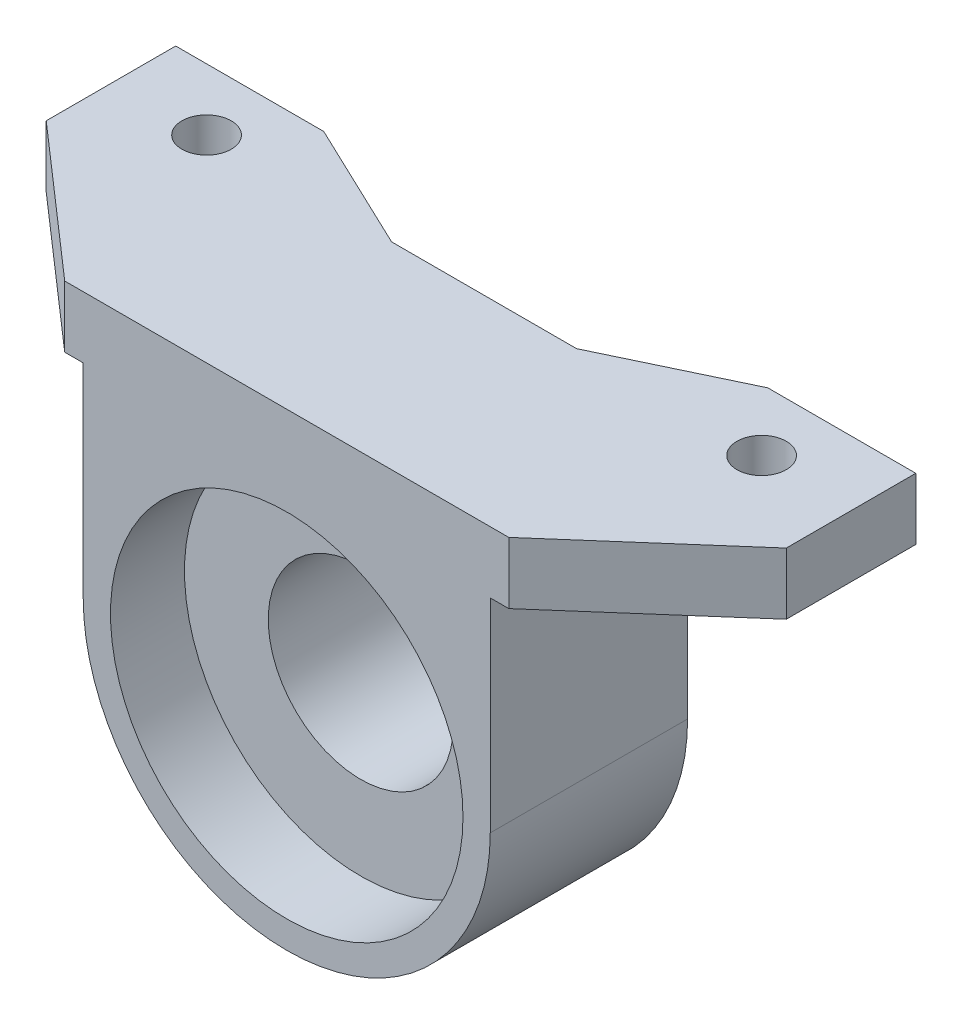
ISO-10303-21;
HEADER;
FILE_DESCRIPTION(('STEP AP214'),'2;1');
FILE_NAME('part.step','',(''),(''),'','','');
FILE_SCHEMA(('AUTOMOTIVE_DESIGN { 1 0 10303 214 1 1 1 1 }'));
ENDSEC;
DATA;
#1=APPLICATION_CONTEXT('core data for automotive mechanical design processes');
#2=APPLICATION_PROTOCOL_DEFINITION('international standard','automotive_design',2000,#1);
#3=PRODUCT_CONTEXT('',#1,'mechanical');
#4=PRODUCT('Part','Part','',(#3));
#5=PRODUCT_RELATED_PRODUCT_CATEGORY('part','',(#4));
#6=PRODUCT_DEFINITION_FORMATION('','',#4);
#7=PRODUCT_DEFINITION_CONTEXT('part definition',#1,'design');
#8=PRODUCT_DEFINITION('design','',#6,#7);
#9=PRODUCT_DEFINITION_SHAPE('','',#8);
#10=(LENGTH_UNIT() NAMED_UNIT(*) SI_UNIT(.MILLI.,.METRE.));
#11=(NAMED_UNIT(*) PLANE_ANGLE_UNIT() SI_UNIT($,.RADIAN.));
#12=(NAMED_UNIT(*) SI_UNIT($,.STERADIAN.) SOLID_ANGLE_UNIT());
#13=UNCERTAINTY_MEASURE_WITH_UNIT(LENGTH_MEASURE(1.E-05),#10,'distance_accuracy_value','');
#14=(GEOMETRIC_REPRESENTATION_CONTEXT(3) GLOBAL_UNCERTAINTY_ASSIGNED_CONTEXT((#13)) GLOBAL_UNIT_ASSIGNED_CONTEXT((#10,
#11,#12)) REPRESENTATION_CONTEXT('',''));
#15=CARTESIAN_POINT('',(0.,0.,0.));
#16=DIRECTION('',(0.,0.,1.));
#17=DIRECTION('',(1.,0.,0.));
#18=AXIS2_PLACEMENT_3D('',#15,#16,#17);
#19=CARTESIAN_POINT('',(0.,0.,6.));
#20=DIRECTION('',(0.,0.,1.));
#21=DIRECTION('',(1.,0.,0.));
#22=AXIS2_PLACEMENT_3D('',#19,#20,#21);
#23=PLANE('',#22);
#24=CARTESIAN_POINT('',(0.,0.,6.));
#25=DIRECTION('',(0.,0.,1.));
#26=DIRECTION('',(1.,0.,0.));
#27=AXIS2_PLACEMENT_3D('',#24,#25,#26);
#28=CIRCLE('',#27,14.29);
#29=CARTESIAN_POINT('',(14.29,0.,6.));
#30=VERTEX_POINT('',#29);
#31=EDGE_CURVE('E70',#30,#30,#28,.T.);
#32=ORIENTED_EDGE('',*,*,#31,.F.);
#33=EDGE_LOOP('',(#32));
#34=FACE_BOUND('',#33,.T.);
#35=DIRECTION('',(1.,0.,0.));
#36=VECTOR('',#35,1.);
#37=CARTESIAN_POINT('',(0.,16.5,6.));
#38=LINE('',#37,#36);
#39=CARTESIAN_POINT('',(16.5,16.5,6.));
#40=VERTEX_POINT('',#39);
#41=CARTESIAN_POINT('',(18.,16.5,6.));
#42=VERTEX_POINT('',#41);
#43=EDGE_CURVE('E232',#40,#42,#38,.T.);
#44=ORIENTED_EDGE('',*,*,#43,.T.);
#45=DIRECTION('',(0.,1.,0.));
#46=VECTOR('',#45,1.);
#47=CARTESIAN_POINT('',(18.,16.5,6.));
#48=LINE('',#47,#46);
#49=CARTESIAN_POINT('',(18.,21.5,6.));
#50=VERTEX_POINT('',#49);
#51=EDGE_CURVE('E315',#42,#50,#48,.T.);
#52=ORIENTED_EDGE('',*,*,#51,.T.);
#53=DIRECTION('',(1.,0.,0.));
#54=VECTOR('',#53,1.);
#55=CARTESIAN_POINT('',(-30.,21.5,6.));
#56=LINE('',#55,#54);
#57=CARTESIAN_POINT('',(-18.,21.5,6.00000000000001));
#58=VERTEX_POINT('',#57);
#59=EDGE_CURVE('E215',#58,#50,#56,.T.);
#60=ORIENTED_EDGE('',*,*,#59,.F.);
#61=DIRECTION('',(0.,1.,0.));
#62=VECTOR('',#61,1.);
#63=CARTESIAN_POINT('',(-18.,16.5,6.00000000000001));
#64=LINE('',#63,#62);
#65=CARTESIAN_POINT('',(-18.,16.5,6.00000000000001));
#66=VERTEX_POINT('',#65);
#67=EDGE_CURVE('E194',#66,#58,#64,.T.);
#68=ORIENTED_EDGE('',*,*,#67,.F.);
#69=CARTESIAN_POINT('',(-16.5,16.5,6.));
#70=VERTEX_POINT('',#69);
#71=EDGE_CURVE('E236',#66,#70,#38,.T.);
#72=ORIENTED_EDGE('',*,*,#71,.T.);
#73=DIRECTION('',(0.,-1.,0.));
#74=VECTOR('',#73,1.);
#75=CARTESIAN_POINT('',(-16.5,0.,6.));
#76=LINE('',#75,#74);
#77=CARTESIAN_POINT('',(-16.5,0.,6.));
#78=VERTEX_POINT('',#77);
#79=EDGE_CURVE('E266',#70,#78,#76,.T.);
#80=ORIENTED_EDGE('',*,*,#79,.T.);
#81=CARTESIAN_POINT('',(0.,0.,6.));
#82=DIRECTION('',(0.,0.,1.));
#83=DIRECTION('',(1.,0.,0.));
#84=AXIS2_PLACEMENT_3D('',#81,#82,#83);
#85=CIRCLE('',#84,16.5);
#86=CARTESIAN_POINT('',(16.5,0.,6.));
#87=VERTEX_POINT('',#86);
#88=EDGE_CURVE('E12',#78,#87,#85,.T.);
#89=ORIENTED_EDGE('',*,*,#88,.T.);
#90=DIRECTION('',(0.,-1.,0.));
#91=VECTOR('',#90,1.);
#92=CARTESIAN_POINT('',(16.5,0.,6.));
#93=LINE('',#92,#91);
#94=EDGE_CURVE('E252',#40,#87,#93,.T.);
#95=ORIENTED_EDGE('',*,*,#94,.F.);
#96=EDGE_LOOP('',(#44,#52,#60,#68,#72,#80,#89,#95));
#97=FACE_BOUND('',#96,.T.);
#98=ADVANCED_FACE('F61',(#34,#97),#23,.T.);
#99=CARTESIAN_POINT('',(0.,16.5,0.));
#100=DIRECTION('',(0.,1.,0.));
#101=DIRECTION('',(0.,0.,1.));
#102=AXIS2_PLACEMENT_3D('',#99,#100,#101);
#103=PLANE('',#102);
#104=CARTESIAN_POINT('',(22.5,16.5,-10.));
#105=DIRECTION('',(0.,1.,0.));
#106=DIRECTION('',(0.,0.,1.));
#107=AXIS2_PLACEMENT_3D('',#104,#105,#106);
#108=CIRCLE('',#107,2.);
#109=CARTESIAN_POINT('',(22.5,16.5,-7.99999999999999));
#110=VERTEX_POINT('',#109);
#111=EDGE_CURVE('E237',#110,#110,#108,.T.);
#112=ORIENTED_EDGE('',*,*,#111,.T.);
#113=EDGE_LOOP('',(#112));
#114=FACE_BOUND('',#113,.T.);
#115=DIRECTION('',(0.752576694706878,0.,-0.658504607868518));
#116=VECTOR('',#115,1.);
#117=CARTESIAN_POINT('',(10.7787610619469,16.5,12.3185840707965));
#118=LINE('',#117,#116);
#119=CARTESIAN_POINT('',(30.,16.5,-4.50000000000001));
#120=VERTEX_POINT('',#119);
#121=EDGE_CURVE('E85',#42,#120,#118,.T.);
#122=ORIENTED_EDGE('',*,*,#121,.F.);
#123=ORIENTED_EDGE('',*,*,#43,.F.);
#124=DIRECTION('',(0.,0.,-1.));
#125=VECTOR('',#124,1.);
#126=CARTESIAN_POINT('',(16.5,16.5,6.));
#127=LINE('',#126,#125);
#128=CARTESIAN_POINT('',(16.5,16.5,-10.));
#129=VERTEX_POINT('',#128);
#130=EDGE_CURVE('E256',#40,#129,#127,.T.);
#131=ORIENTED_EDGE('',*,*,#130,.T.);
#132=DIRECTION('',(-1.,0.,0.));
#133=VECTOR('',#132,1.);
#134=CARTESIAN_POINT('',(30.,16.5,-10.));
#135=LINE('',#134,#133);
#136=CARTESIAN_POINT('',(7.5,16.5,-10.));
#137=VERTEX_POINT('',#136);
#138=EDGE_CURVE('E193',#129,#137,#135,.T.);
#139=ORIENTED_EDGE('',*,*,#138,.T.);
#140=DIRECTION('',(0.90286051882393,0.,-0.429933580392348));
#141=VECTOR('',#140,1.);
#142=CARTESIAN_POINT('',(-2.49537892791127,16.5,-5.24029574861367));
#143=LINE('',#142,#141);
#144=CARTESIAN_POINT('',(18.,16.5,-15.));
#145=VERTEX_POINT('',#144);
#146=EDGE_CURVE('E185',#137,#145,#143,.T.);
#147=ORIENTED_EDGE('',*,*,#146,.T.);
#148=DIRECTION('',(-1.,0.,0.));
#149=VECTOR('',#148,1.);
#150=CARTESIAN_POINT('',(30.,16.5,-15.));
#151=LINE('',#150,#149);
#152=CARTESIAN_POINT('',(30.,16.5,-15.));
#153=VERTEX_POINT('',#152);
#154=EDGE_CURVE('E343',#153,#145,#151,.T.);
#155=ORIENTED_EDGE('',*,*,#154,.F.);
#156=DIRECTION('',(0.,0.,-1.));
#157=VECTOR('',#156,1.);
#158=CARTESIAN_POINT('',(30.,16.5,0.));
#159=LINE('',#158,#157);
#160=EDGE_CURVE('E241',#120,#153,#159,.T.);
#161=ORIENTED_EDGE('',*,*,#160,.F.);
#162=EDGE_LOOP('',(#122,#123,#131,#139,#147,#155,#161));
#163=FACE_BOUND('',#162,.T.);
#164=ADVANCED_FACE('F303',(#114,#163),#103,.F.);
#165=CARTESIAN_POINT('',(-22.5,16.5,-10.));
#166=DIRECTION('',(0.,1.,0.));
#167=DIRECTION('',(0.,0.,1.));
#168=AXIS2_PLACEMENT_3D('',#165,#166,#167);
#169=CIRCLE('',#168,2.);
#170=CARTESIAN_POINT('',(-22.5,16.5,-7.99999999999999));
#171=VERTEX_POINT('',#170);
#172=EDGE_CURVE('E247',#171,#171,#169,.T.);
#173=ORIENTED_EDGE('',*,*,#172,.T.);
#174=EDGE_LOOP('',(#173));
#175=FACE_BOUND('',#174,.T.);
#176=CARTESIAN_POINT('',(-18.,16.5,-15.));
#177=VERTEX_POINT('',#176);
#178=CARTESIAN_POINT('',(-30.,16.5,-15.));
#179=VERTEX_POINT('',#178);
#180=EDGE_CURVE('E183',#177,#179,#151,.T.);
#181=ORIENTED_EDGE('',*,*,#180,.F.);
#182=DIRECTION('',(0.90286051882393,0.,0.429933580392348));
#183=VECTOR('',#182,1.);
#184=CARTESIAN_POINT('',(2.49537892791128,16.5,-5.24029574861368));
#185=LINE('',#184,#183);
#186=CARTESIAN_POINT('',(-7.49999999999999,16.5,-9.99999999999999));
#187=VERTEX_POINT('',#186);
#188=EDGE_CURVE('E164',#177,#187,#185,.T.);
#189=ORIENTED_EDGE('',*,*,#188,.T.);
#190=CARTESIAN_POINT('',(-16.5,16.5,-10.));
#191=VERTEX_POINT('',#190);
#192=EDGE_CURVE('E180',#187,#191,#135,.T.);
#193=ORIENTED_EDGE('',*,*,#192,.T.);
#194=DIRECTION('',(0.,0.,-1.));
#195=VECTOR('',#194,1.);
#196=CARTESIAN_POINT('',(-16.5,16.5,6.));
#197=LINE('',#196,#195);
#198=EDGE_CURVE('E275',#70,#191,#197,.T.);
#199=ORIENTED_EDGE('',*,*,#198,.F.);
#200=ORIENTED_EDGE('',*,*,#71,.F.);
#201=DIRECTION('',(0.752576694706878,0.,0.658504607868518));
#202=VECTOR('',#201,1.);
#203=CARTESIAN_POINT('',(-10.7787610619469,16.5,12.3185840707965));
#204=LINE('',#203,#202);
#205=CARTESIAN_POINT('',(-30.,16.5,-4.50000000000001));
#206=VERTEX_POINT('',#205);
#207=EDGE_CURVE('E330',#206,#66,#204,.T.);
#208=ORIENTED_EDGE('',*,*,#207,.F.);
#209=DIRECTION('',(0.,0.,-1.));
#210=VECTOR('',#209,1.);
#211=CARTESIAN_POINT('',(-30.,16.5,0.));
#212=LINE('',#211,#210);
#213=EDGE_CURVE('E244',#206,#179,#212,.T.);
#214=ORIENTED_EDGE('',*,*,#213,.T.);
#215=EDGE_LOOP('',(#181,#189,#193,#199,#200,#208,#214));
#216=FACE_BOUND('',#215,.T.);
#217=ADVANCED_FACE('F178',(#175,#216),#103,.F.);
#218=CARTESIAN_POINT('',(0.,21.5,0.));
#219=DIRECTION('',(0.,1.,0.));
#220=DIRECTION('',(0.,0.,1.));
#221=AXIS2_PLACEMENT_3D('',#218,#219,#220);
#222=PLANE('',#221);
#223=CARTESIAN_POINT('',(22.5,21.5,-10.));
#224=DIRECTION('',(0.,1.,0.));
#225=DIRECTION('',(0.,0.,1.));
#226=AXIS2_PLACEMENT_3D('',#223,#224,#225);
#227=CIRCLE('',#226,2.);
#228=CARTESIAN_POINT('',(22.5,21.5,-7.99999999999999));
#229=VERTEX_POINT('',#228);
#230=EDGE_CURVE('E228',#229,#229,#227,.T.);
#231=ORIENTED_EDGE('',*,*,#230,.F.);
#232=EDGE_LOOP('',(#231));
#233=FACE_BOUND('',#232,.T.);
#234=CARTESIAN_POINT('',(-22.5,21.5,-10.));
#235=DIRECTION('',(0.,1.,0.));
#236=DIRECTION('',(0.,0.,1.));
#237=AXIS2_PLACEMENT_3D('',#234,#235,#236);
#238=CIRCLE('',#237,2.);
#239=CARTESIAN_POINT('',(-22.5,21.5,-7.99999999999999));
#240=VERTEX_POINT('',#239);
#241=EDGE_CURVE('E219',#240,#240,#238,.T.);
#242=ORIENTED_EDGE('',*,*,#241,.F.);
#243=EDGE_LOOP('',(#242));
#244=FACE_BOUND('',#243,.T.);
#245=ORIENTED_EDGE('',*,*,#59,.T.);
#246=DIRECTION('',(0.752576694706878,0.,-0.658504607868518));
#247=VECTOR('',#246,1.);
#248=CARTESIAN_POINT('',(10.7787610619469,21.5,12.3185840707965));
#249=LINE('',#248,#247);
#250=CARTESIAN_POINT('',(30.,21.5,-4.50000000000001));
#251=VERTEX_POINT('',#250);
#252=EDGE_CURVE('E364',#50,#251,#249,.T.);
#253=ORIENTED_EDGE('',*,*,#252,.T.);
#254=DIRECTION('',(0.,0.,-1.));
#255=VECTOR('',#254,1.);
#256=CARTESIAN_POINT('',(30.,21.5,0.));
#257=LINE('',#256,#255);
#258=CARTESIAN_POINT('',(30.,21.5,-15.));
#259=VERTEX_POINT('',#258);
#260=EDGE_CURVE('E220',#251,#259,#257,.T.);
#261=ORIENTED_EDGE('',*,*,#260,.T.);
#262=DIRECTION('',(1.,0.,0.));
#263=VECTOR('',#262,1.);
#264=CARTESIAN_POINT('',(30.,21.5,-15.));
#265=LINE('',#264,#263);
#266=CARTESIAN_POINT('',(18.,21.5,-15.));
#267=VERTEX_POINT('',#266);
#268=EDGE_CURVE('E337',#267,#259,#265,.T.);
#269=ORIENTED_EDGE('',*,*,#268,.F.);
#270=DIRECTION('',(0.90286051882393,0.,-0.429933580392348));
#271=VECTOR('',#270,1.);
#272=CARTESIAN_POINT('',(-2.49537892791127,21.5,-5.24029574861367));
#273=LINE('',#272,#271);
#274=CARTESIAN_POINT('',(7.5,21.5,-10.));
#275=VERTEX_POINT('',#274);
#276=EDGE_CURVE('E186',#275,#267,#273,.T.);
#277=ORIENTED_EDGE('',*,*,#276,.F.);
#278=DIRECTION('',(1.,0.,0.));
#279=VECTOR('',#278,1.);
#280=CARTESIAN_POINT('',(0.,21.5,-10.));
#281=LINE('',#280,#279);
#282=CARTESIAN_POINT('',(-7.49999999999999,21.5,-9.99999999999999));
#283=VERTEX_POINT('',#282);
#284=EDGE_CURVE('E380',#283,#275,#281,.T.);
#285=ORIENTED_EDGE('',*,*,#284,.F.);
#286=DIRECTION('',(0.90286051882393,0.,0.429933580392348));
#287=VECTOR('',#286,1.);
#288=CARTESIAN_POINT('',(2.49537892791128,21.5,-5.24029574861368));
#289=LINE('',#288,#287);
#290=CARTESIAN_POINT('',(-18.,21.5,-15.));
#291=VERTEX_POINT('',#290);
#292=EDGE_CURVE('E167',#291,#283,#289,.T.);
#293=ORIENTED_EDGE('',*,*,#292,.F.);
#294=CARTESIAN_POINT('',(-30.,21.5,-15.));
#295=VERTEX_POINT('',#294);
#296=EDGE_CURVE('E204',#295,#291,#265,.T.);
#297=ORIENTED_EDGE('',*,*,#296,.F.);
#298=DIRECTION('',(0.,0.,-1.));
#299=VECTOR('',#298,1.);
#300=CARTESIAN_POINT('',(-30.,21.5,0.));
#301=LINE('',#300,#299);
#302=CARTESIAN_POINT('',(-30.,21.5,-4.50000000000001));
#303=VERTEX_POINT('',#302);
#304=EDGE_CURVE('E210',#303,#295,#301,.T.);
#305=ORIENTED_EDGE('',*,*,#304,.F.);
#306=DIRECTION('',(0.752576694706878,0.,0.658504607868518));
#307=VECTOR('',#306,1.);
#308=CARTESIAN_POINT('',(-10.7787610619469,21.5,12.3185840707965));
#309=LINE('',#308,#307);
#310=EDGE_CURVE('E77',#303,#58,#309,.T.);
#311=ORIENTED_EDGE('',*,*,#310,.T.);
#312=EDGE_LOOP('',(#245,#253,#261,#269,#277,#285,#293,#297,#305,#311));
#313=FACE_BOUND('',#312,.T.);
#314=ADVANCED_FACE('F394',(#233,#244,#313),#222,.T.);
#315=CARTESIAN_POINT('',(-30.,-16.5,0.));
#316=DIRECTION('',(1.,0.,0.));
#317=DIRECTION('',(0.,0.,-1.));
#318=AXIS2_PLACEMENT_3D('',#315,#316,#317);
#319=PLANE('',#318);
#320=DIRECTION('',(0.,1.,0.));
#321=VECTOR('',#320,1.);
#322=CARTESIAN_POINT('',(-30.,16.5,-4.50000000000001));
#323=LINE('',#322,#321);
#324=EDGE_CURVE('E200',#206,#303,#323,.T.);
#325=ORIENTED_EDGE('',*,*,#324,.T.);
#326=ORIENTED_EDGE('',*,*,#304,.T.);
#327=DIRECTION('',(0.,1.,0.));
#328=VECTOR('',#327,1.);
#329=CARTESIAN_POINT('',(-30.,21.5,-15.));
#330=LINE('',#329,#328);
#331=EDGE_CURVE('E340',#179,#295,#330,.T.);
#332=ORIENTED_EDGE('',*,*,#331,.F.);
#333=ORIENTED_EDGE('',*,*,#213,.F.);
#334=EDGE_LOOP('',(#325,#326,#332,#333));
#335=FACE_BOUND('',#334,.T.);
#336=ADVANCED_FACE('F422',(#335),#319,.F.);
#337=CARTESIAN_POINT('',(30.,-16.5,0.));
#338=DIRECTION('',(1.,0.,0.));
#339=DIRECTION('',(0.,0.,-1.));
#340=AXIS2_PLACEMENT_3D('',#337,#338,#339);
#341=PLANE('',#340);
#342=ORIENTED_EDGE('',*,*,#260,.F.);
#343=DIRECTION('',(0.,1.,0.));
#344=VECTOR('',#343,1.);
#345=CARTESIAN_POINT('',(30.,16.5,-4.50000000000001));
#346=LINE('',#345,#344);
#347=EDGE_CURVE('E357',#120,#251,#346,.T.);
#348=ORIENTED_EDGE('',*,*,#347,.F.);
#349=ORIENTED_EDGE('',*,*,#160,.T.);
#350=DIRECTION('',(0.,-1.,0.));
#351=VECTOR('',#350,1.);
#352=CARTESIAN_POINT('',(30.,21.5,-15.));
#353=LINE('',#352,#351);
#354=EDGE_CURVE('E199',#259,#153,#353,.T.);
#355=ORIENTED_EDGE('',*,*,#354,.F.);
#356=EDGE_LOOP('',(#342,#348,#349,#355));
#357=FACE_BOUND('',#356,.T.);
#358=ADVANCED_FACE('F397',(#357),#341,.T.);
#359=CARTESIAN_POINT('',(0.,0.,-15.));
#360=DIRECTION('',(0.,0.,-1.));
#361=DIRECTION('',(-1.,0.,0.));
#362=AXIS2_PLACEMENT_3D('',#359,#360,#361);
#363=PLANE('',#362);
#364=DIRECTION('',(0.,1.,0.));
#365=VECTOR('',#364,1.);
#366=CARTESIAN_POINT('',(18.,16.5,-15.));
#367=LINE('',#366,#365);
#368=EDGE_CURVE('E368',#145,#267,#367,.T.);
#369=ORIENTED_EDGE('',*,*,#368,.T.);
#370=ORIENTED_EDGE('',*,*,#268,.T.);
#371=ORIENTED_EDGE('',*,*,#354,.T.);
#372=ORIENTED_EDGE('',*,*,#154,.T.);
#373=EDGE_LOOP('',(#369,#370,#371,#372));
#374=FACE_BOUND('',#373,.T.);
#375=ADVANCED_FACE('F390',(#374),#363,.T.);
#376=CARTESIAN_POINT('',(0.,0.,-10.));
#377=DIRECTION('',(0.,0.,-1.));
#378=DIRECTION('',(-1.,0.,0.));
#379=AXIS2_PLACEMENT_3D('',#376,#377,#378);
#380=PLANE('',#379);
#381=CARTESIAN_POINT('',(0.,0.,-10.));
#382=DIRECTION('',(0.,0.,1.));
#383=DIRECTION('',(1.,0.,0.));
#384=AXIS2_PLACEMENT_3D('',#381,#382,#383);
#385=CIRCLE('',#384,7.5);
#386=CARTESIAN_POINT('',(7.5,0.,-10.));
#387=VERTEX_POINT('',#386);
#388=EDGE_CURVE('E206',#387,#387,#385,.T.);
#389=ORIENTED_EDGE('',*,*,#388,.T.);
#390=EDGE_LOOP('',(#389));
#391=FACE_BOUND('',#390,.T.);
#392=DIRECTION('',(0.,-1.,0.));
#393=VECTOR('',#392,1.);
#394=CARTESIAN_POINT('',(-16.5,0.,-10.));
#395=LINE('',#394,#393);
#396=CARTESIAN_POINT('',(-16.5,0.,-10.));
#397=VERTEX_POINT('',#396);
#398=EDGE_CURVE('E191',#191,#397,#395,.T.);
#399=ORIENTED_EDGE('',*,*,#398,.F.);
#400=ORIENTED_EDGE('',*,*,#192,.F.);
#401=DIRECTION('',(0.,1.,0.));
#402=VECTOR('',#401,1.);
#403=CARTESIAN_POINT('',(-7.49999999999999,16.5,-9.99999999999999));
#404=LINE('',#403,#402);
#405=EDGE_CURVE('E161',#187,#283,#404,.T.);
#406=ORIENTED_EDGE('',*,*,#405,.T.);
#407=ORIENTED_EDGE('',*,*,#284,.T.);
#408=DIRECTION('',(0.,1.,0.));
#409=VECTOR('',#408,1.);
#410=CARTESIAN_POINT('',(7.5,16.5,-10.));
#411=LINE('',#410,#409);
#412=EDGE_CURVE('E173',#137,#275,#411,.T.);
#413=ORIENTED_EDGE('',*,*,#412,.F.);
#414=ORIENTED_EDGE('',*,*,#138,.F.);
#415=DIRECTION('',(0.,-1.,0.));
#416=VECTOR('',#415,1.);
#417=CARTESIAN_POINT('',(16.5,0.,-10.));
#418=LINE('',#417,#416);
#419=CARTESIAN_POINT('',(16.5,0.,-10.));
#420=VERTEX_POINT('',#419);
#421=EDGE_CURVE('E251',#129,#420,#418,.T.);
#422=ORIENTED_EDGE('',*,*,#421,.T.);
#423=CARTESIAN_POINT('',(0.,0.,-10.));
#424=DIRECTION('',(0.,0.,-1.));
#425=DIRECTION('',(-1.,0.,0.));
#426=AXIS2_PLACEMENT_3D('',#423,#424,#425);
#427=CIRCLE('',#426,16.5);
#428=EDGE_CURVE('E278',#420,#397,#427,.T.);
#429=ORIENTED_EDGE('',*,*,#428,.T.);
#430=EDGE_LOOP('',(#399,#400,#406,#407,#413,#414,#422,#429));
#431=FACE_BOUND('',#430,.T.);
#432=ADVANCED_FACE('F189',(#391,#431),#380,.T.);
#433=CARTESIAN_POINT('',(0.,0.,6.));
#434=DIRECTION('',(0.,0.,-1.));
#435=DIRECTION('',(-1.,0.,0.));
#436=AXIS2_PLACEMENT_3D('',#433,#434,#435);
#437=CYLINDRICAL_SURFACE('',#436,16.5);
#438=DIRECTION('',(0.,0.,-1.));
#439=VECTOR('',#438,1.);
#440=CARTESIAN_POINT('',(16.5,0.,6.));
#441=LINE('',#440,#439);
#442=EDGE_CURVE('E263',#87,#420,#441,.T.);
#443=ORIENTED_EDGE('',*,*,#442,.F.);
#444=ORIENTED_EDGE('',*,*,#88,.F.);
#445=DIRECTION('',(0.,0.,-1.));
#446=VECTOR('',#445,1.);
#447=CARTESIAN_POINT('',(-16.5,0.,6.));
#448=LINE('',#447,#446);
#449=EDGE_CURVE('E269',#78,#397,#448,.T.);
#450=ORIENTED_EDGE('',*,*,#449,.T.);
#451=ORIENTED_EDGE('',*,*,#428,.F.);
#452=EDGE_LOOP('',(#443,#444,#450,#451));
#453=FACE_BOUND('',#452,.T.);
#454=ADVANCED_FACE('F63',(#453),#437,.T.);
#455=CARTESIAN_POINT('',(0.,0.,6.));
#456=DIRECTION('',(0.,0.,-1.));
#457=DIRECTION('',(-1.,0.,0.));
#458=AXIS2_PLACEMENT_3D('',#455,#456,#457);
#459=CYLINDRICAL_SURFACE('',#458,14.29);
#460=ORIENTED_EDGE('',*,*,#31,.T.);
#461=EDGE_LOOP('',(#460));
#462=FACE_BOUND('',#461,.T.);
#463=CARTESIAN_POINT('',(0.,0.,0.));
#464=DIRECTION('',(0.,0.,1.));
#465=DIRECTION('',(1.,0.,0.));
#466=AXIS2_PLACEMENT_3D('',#463,#464,#465);
#467=CIRCLE('',#466,14.29);
#468=CARTESIAN_POINT('',(14.29,0.,0.));
#469=VERTEX_POINT('',#468);
#470=EDGE_CURVE('E281',#469,#469,#467,.T.);
#471=ORIENTED_EDGE('',*,*,#470,.F.);
#472=EDGE_LOOP('',(#471));
#473=FACE_BOUND('',#472,.T.);
#474=ADVANCED_FACE('F290',(#462,#473),#459,.F.);
#475=CARTESIAN_POINT('',(0.,0.,0.));
#476=DIRECTION('',(0.,0.,-1.));
#477=DIRECTION('',(-1.,0.,0.));
#478=AXIS2_PLACEMENT_3D('',#475,#476,#477);
#479=PLANE('',#478);
#480=CARTESIAN_POINT('',(0.,0.,0.));
#481=DIRECTION('',(0.,0.,1.));
#482=DIRECTION('',(1.,0.,0.));
#483=AXIS2_PLACEMENT_3D('',#480,#481,#482);
#484=CIRCLE('',#483,7.5);
#485=CARTESIAN_POINT('',(7.5,0.,0.));
#486=VERTEX_POINT('',#485);
#487=EDGE_CURVE('E211',#486,#486,#484,.T.);
#488=ORIENTED_EDGE('',*,*,#487,.F.);
#489=EDGE_LOOP('',(#488));
#490=FACE_BOUND('',#489,.T.);
#491=ORIENTED_EDGE('',*,*,#470,.T.);
#492=EDGE_LOOP('',(#491));
#493=FACE_BOUND('',#492,.T.);
#494=ADVANCED_FACE('F288',(#490,#493),#479,.F.);
#495=CARTESIAN_POINT('',(-16.5,0.,6.));
#496=DIRECTION('',(1.,0.,0.));
#497=DIRECTION('',(0.,1.,0.));
#498=AXIS2_PLACEMENT_3D('',#495,#496,#497);
#499=PLANE('',#498);
#500=ORIENTED_EDGE('',*,*,#398,.T.);
#501=ORIENTED_EDGE('',*,*,#449,.F.);
#502=ORIENTED_EDGE('',*,*,#79,.F.);
#503=ORIENTED_EDGE('',*,*,#198,.T.);
#504=EDGE_LOOP('',(#500,#501,#502,#503));
#505=FACE_BOUND('',#504,.T.);
#506=ADVANCED_FACE('F298',(#505),#499,.F.);
#507=CARTESIAN_POINT('',(16.5,0.,6.));
#508=DIRECTION('',(1.,0.,0.));
#509=DIRECTION('',(0.,1.,0.));
#510=AXIS2_PLACEMENT_3D('',#507,#508,#509);
#511=PLANE('',#510);
#512=ORIENTED_EDGE('',*,*,#421,.F.);
#513=ORIENTED_EDGE('',*,*,#130,.F.);
#514=ORIENTED_EDGE('',*,*,#94,.T.);
#515=ORIENTED_EDGE('',*,*,#442,.T.);
#516=EDGE_LOOP('',(#512,#513,#514,#515));
#517=FACE_BOUND('',#516,.T.);
#518=ADVANCED_FACE('F321',(#517),#511,.T.);
#519=CARTESIAN_POINT('',(22.5,-16.5,-10.));
#520=DIRECTION('',(0.,1.,0.));
#521=DIRECTION('',(0.,0.,1.));
#522=AXIS2_PLACEMENT_3D('',#519,#520,#521);
#523=CYLINDRICAL_SURFACE('',#522,2.);
#524=ORIENTED_EDGE('',*,*,#230,.T.);
#525=EDGE_LOOP('',(#524));
#526=FACE_BOUND('',#525,.T.);
#527=ORIENTED_EDGE('',*,*,#111,.F.);
#528=EDGE_LOOP('',(#527));
#529=FACE_BOUND('',#528,.T.);
#530=ADVANCED_FACE('F428',(#526,#529),#523,.F.);
#531=CARTESIAN_POINT('',(-22.5,-16.5,-10.));
#532=DIRECTION('',(0.,1.,0.));
#533=DIRECTION('',(0.,0.,1.));
#534=AXIS2_PLACEMENT_3D('',#531,#532,#533);
#535=CYLINDRICAL_SURFACE('',#534,2.);
#536=ORIENTED_EDGE('',*,*,#241,.T.);
#537=EDGE_LOOP('',(#536));
#538=FACE_BOUND('',#537,.T.);
#539=ORIENTED_EDGE('',*,*,#172,.F.);
#540=EDGE_LOOP('',(#539));
#541=FACE_BOUND('',#540,.T.);
#542=ADVANCED_FACE('F418',(#538,#541),#535,.F.);
#543=CARTESIAN_POINT('',(0.,0.,-10.));
#544=DIRECTION('',(0.,0.,1.));
#545=DIRECTION('',(1.,0.,0.));
#546=AXIS2_PLACEMENT_3D('',#543,#544,#545);
#547=CYLINDRICAL_SURFACE('',#546,7.5);
#548=ORIENTED_EDGE('',*,*,#388,.F.);
#549=EDGE_LOOP('',(#548));
#550=FACE_BOUND('',#549,.T.);
#551=ORIENTED_EDGE('',*,*,#487,.T.);
#552=EDGE_LOOP('',(#551));
#553=FACE_BOUND('',#552,.T.);
#554=ADVANCED_FACE('F414',(#550,#553),#547,.F.);
#555=DIRECTION('',(0.,1.,0.));
#556=VECTOR('',#555,1.);
#557=CARTESIAN_POINT('',(-18.,16.5,-15.));
#558=LINE('',#557,#556);
#559=EDGE_CURVE('E174',#177,#291,#558,.T.);
#560=ORIENTED_EDGE('',*,*,#559,.F.);
#561=ORIENTED_EDGE('',*,*,#180,.T.);
#562=ORIENTED_EDGE('',*,*,#331,.T.);
#563=ORIENTED_EDGE('',*,*,#296,.T.);
#564=EDGE_LOOP('',(#560,#561,#562,#563));
#565=FACE_BOUND('',#564,.T.);
#566=ADVANCED_FACE('F411',(#565),#363,.T.);
#567=CARTESIAN_POINT('',(-2.49537892791127,16.5,-5.24029574861367));
#568=DIRECTION('',(0.429933580392348,0.,0.90286051882393));
#569=DIRECTION('',(0.90286051882393,0.,-0.429933580392348));
#570=AXIS2_PLACEMENT_3D('',#567,#568,#569);
#571=PLANE('',#570);
#572=ORIENTED_EDGE('',*,*,#276,.T.);
#573=ORIENTED_EDGE('',*,*,#368,.F.);
#574=ORIENTED_EDGE('',*,*,#146,.F.);
#575=ORIENTED_EDGE('',*,*,#412,.T.);
#576=EDGE_LOOP('',(#572,#573,#574,#575));
#577=FACE_BOUND('',#576,.T.);
#578=ADVANCED_FACE('F407',(#577),#571,.F.);
#579=CARTESIAN_POINT('',(2.49537892791128,16.5,-5.24029574861368));
#580=DIRECTION('',(-0.429933580392348,0.,0.90286051882393));
#581=DIRECTION('',(0.90286051882393,0.,0.429933580392348));
#582=AXIS2_PLACEMENT_3D('',#579,#580,#581);
#583=PLANE('',#582);
#584=ORIENTED_EDGE('',*,*,#292,.T.);
#585=ORIENTED_EDGE('',*,*,#405,.F.);
#586=ORIENTED_EDGE('',*,*,#188,.F.);
#587=ORIENTED_EDGE('',*,*,#559,.T.);
#588=EDGE_LOOP('',(#584,#585,#586,#587));
#589=FACE_BOUND('',#588,.T.);
#590=ADVANCED_FACE('F163',(#589),#583,.F.);
#591=CARTESIAN_POINT('',(10.7787610619469,16.5,12.3185840707965));
#592=DIRECTION('',(0.658504607868518,0.,0.752576694706878));
#593=DIRECTION('',(0.752576694706878,0.,-0.658504607868518));
#594=AXIS2_PLACEMENT_3D('',#591,#592,#593);
#595=PLANE('',#594);
#596=ORIENTED_EDGE('',*,*,#252,.F.);
#597=ORIENTED_EDGE('',*,*,#51,.F.);
#598=ORIENTED_EDGE('',*,*,#121,.T.);
#599=ORIENTED_EDGE('',*,*,#347,.T.);
#600=EDGE_LOOP('',(#596,#597,#598,#599));
#601=FACE_BOUND('',#600,.T.);
#602=ADVANCED_FACE('F398',(#601),#595,.T.);
#603=CARTESIAN_POINT('',(-10.7787610619469,16.5,12.3185840707965));
#604=DIRECTION('',(-0.658504607868518,0.,0.752576694706878));
#605=DIRECTION('',(0.752576694706878,0.,0.658504607868518));
#606=AXIS2_PLACEMENT_3D('',#603,#604,#605);
#607=PLANE('',#606);
#608=ORIENTED_EDGE('',*,*,#310,.F.);
#609=ORIENTED_EDGE('',*,*,#324,.F.);
#610=ORIENTED_EDGE('',*,*,#207,.T.);
#611=ORIENTED_EDGE('',*,*,#67,.T.);
#612=EDGE_LOOP('',(#608,#609,#610,#611));
#613=FACE_BOUND('',#612,.T.);
#614=ADVANCED_FACE('F400',(#613),#607,.T.);
#615=CLOSED_SHELL('',(#98,#164,#217,#314,#336,#358,#375,#432,#454,#474,#494,#506,#518,#530,#542,
#554,#566,#578,#590,#602,#614));
#616=MANIFOLD_SOLID_BREP('B2',#615);
#617=ADVANCED_BREP_SHAPE_REPRESENTATION('',(#18,#616),#14);
#618=SHAPE_DEFINITION_REPRESENTATION(#9,#617);
ENDSEC;
END-ISO-10303-21;
